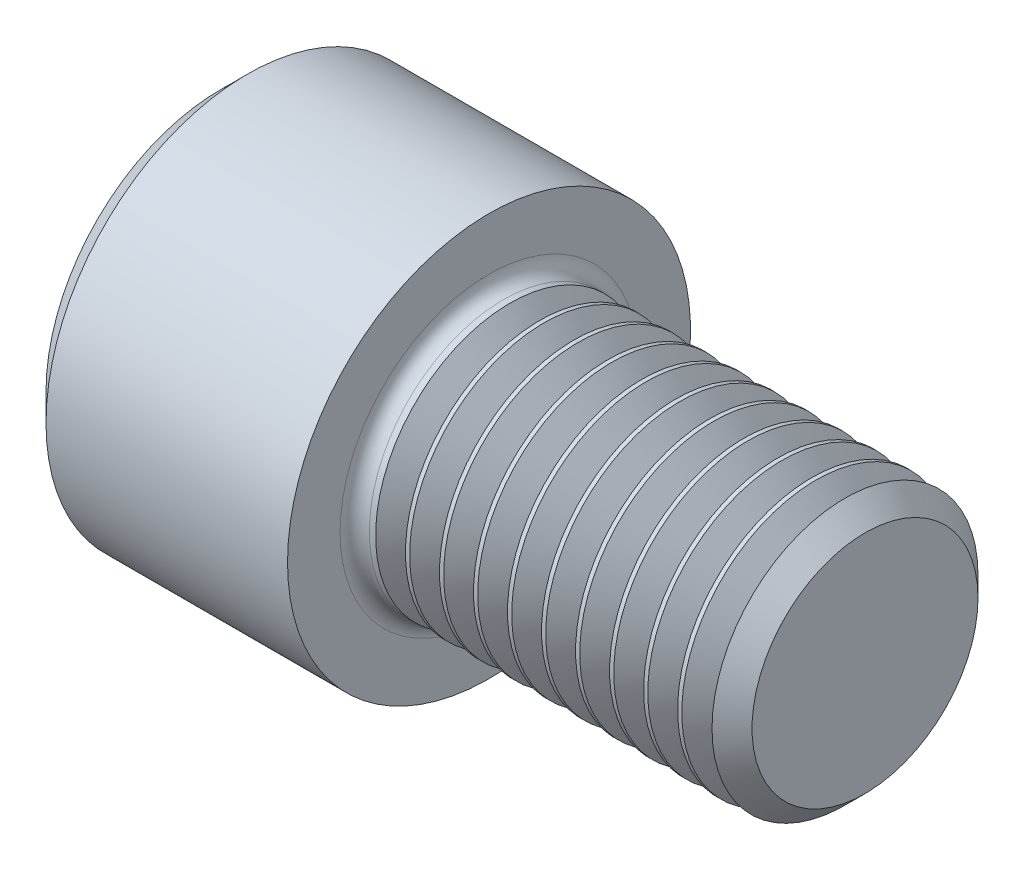
ISO-10303-21;
HEADER;
FILE_DESCRIPTION(('STEP AP214'),'2;1');
FILE_NAME('part.step','',(''),(''),'','','');
FILE_SCHEMA(('AUTOMOTIVE_DESIGN { 1 0 10303 214 1 1 1 1 }'));
ENDSEC;
DATA;
#1=APPLICATION_CONTEXT('core data for automotive mechanical design processes');
#2=APPLICATION_PROTOCOL_DEFINITION('international standard','automotive_design',2000,#1);
#3=PRODUCT_CONTEXT('',#1,'mechanical');
#4=PRODUCT('Part','Part','',(#3));
#5=PRODUCT_RELATED_PRODUCT_CATEGORY('part','',(#4));
#6=PRODUCT_DEFINITION_FORMATION('','',#4);
#7=PRODUCT_DEFINITION_CONTEXT('part definition',#1,'design');
#8=PRODUCT_DEFINITION('design','',#6,#7);
#9=PRODUCT_DEFINITION_SHAPE('','',#8);
#10=(LENGTH_UNIT() NAMED_UNIT(*) SI_UNIT(.MILLI.,.METRE.));
#11=(NAMED_UNIT(*) PLANE_ANGLE_UNIT() SI_UNIT($,.RADIAN.));
#12=(NAMED_UNIT(*) SI_UNIT($,.STERADIAN.) SOLID_ANGLE_UNIT());
#13=UNCERTAINTY_MEASURE_WITH_UNIT(LENGTH_MEASURE(1.E-05),#10,'distance_accuracy_value','');
#14=(GEOMETRIC_REPRESENTATION_CONTEXT(3) GLOBAL_UNCERTAINTY_ASSIGNED_CONTEXT((#13)) GLOBAL_UNIT_ASSIGNED_CONTEXT((#10,
#11,#12)) REPRESENTATION_CONTEXT('',''));
#15=CARTESIAN_POINT('',(0.,0.,0.));
#16=DIRECTION('',(0.,0.,1.));
#17=DIRECTION('',(1.,0.,0.));
#18=AXIS2_PLACEMENT_3D('',#15,#16,#17);
#19=CARTESIAN_POINT('',(3.8354,0.,0.));
#20=DIRECTION('',(-1.,0.,0.));
#21=DIRECTION('',(0.,0.,1.));
#22=AXIS2_PLACEMENT_3D('',#19,#20,#21);
#23=PLANE('',#22);
#24=DIRECTION('',(0.,0.499999999999998,-0.86602540378444));
#25=VECTOR('',#24,1.);
#26=CARTESIAN_POINT('',(3.8354,1.83308710467707,3.175));
#27=LINE('',#26,#25);
#28=CARTESIAN_POINT('',(3.8354,1.83308710467707,3.175));
#29=VERTEX_POINT('',#28);
#30=CARTESIAN_POINT('',(3.83540000001034,2.7496306570156,1.5875));
#31=VERTEX_POINT('',#30);
#32=EDGE_CURVE('E158',#29,#31,#27,.T.);
#33=ORIENTED_EDGE('',*,*,#32,.T.);
#34=CARTESIAN_POINT('',(3.83540000001034,0.,0.));
#35=DIRECTION('',(1.,0.,0.));
#36=DIRECTION('',(0.,1.,0.));
#37=AXIS2_PLACEMENT_3D('',#34,#35,#36);
#38=CIRCLE('',#37,3.17499999999668);
#39=CARTESIAN_POINT('',(3.83540000001034,0.,3.17499999999668));
#40=VERTEX_POINT('',#39);
#41=EDGE_CURVE('E48',#31,#40,#38,.T.);
#42=ORIENTED_EDGE('',*,*,#41,.T.);
#43=DIRECTION('',(0.,1.,0.));
#44=VECTOR('',#43,1.);
#45=CARTESIAN_POINT('',(3.8354,-1.83308710467705,3.175));
#46=LINE('',#45,#44);
#47=EDGE_CURVE('E486',#40,#29,#46,.T.);
#48=ORIENTED_EDGE('',*,*,#47,.T.);
#49=EDGE_LOOP('',(#33,#42,#48));
#50=FACE_BOUND('',#49,.T.);
#51=ADVANCED_FACE('F33',(#50),#23,.T.);
#52=CARTESIAN_POINT('',(3.8354,-1.83308710467705,3.175));
#53=VERTEX_POINT('',#52);
#54=EDGE_CURVE('E487',#53,#40,#46,.T.);
#55=ORIENTED_EDGE('',*,*,#54,.T.);
#56=CARTESIAN_POINT('',(3.83540000001034,-2.74963065701272,1.58749999999834));
#57=VERTEX_POINT('',#56);
#58=EDGE_CURVE('E288',#40,#57,#38,.T.);
#59=ORIENTED_EDGE('',*,*,#58,.T.);
#60=DIRECTION('',(0.,0.500000000000001,0.866025403784438));
#61=VECTOR('',#60,1.);
#62=CARTESIAN_POINT('',(3.8354,-3.66617420935412,0.));
#63=LINE('',#62,#61);
#64=EDGE_CURVE('E483',#57,#53,#63,.T.);
#65=ORIENTED_EDGE('',*,*,#64,.T.);
#66=EDGE_LOOP('',(#55,#59,#65));
#67=FACE_BOUND('',#66,.T.);
#68=ADVANCED_FACE('F121',(#67),#23,.T.);
#69=CARTESIAN_POINT('',(3.8354,-3.66617420935412,0.));
#70=VERTEX_POINT('',#69);
#71=EDGE_CURVE('E484',#70,#57,#63,.T.);
#72=ORIENTED_EDGE('',*,*,#71,.T.);
#73=CARTESIAN_POINT('',(3.83540000001034,-2.74963065701272,-1.58749999999834));
#74=VERTEX_POINT('',#73);
#75=EDGE_CURVE('E498',#57,#74,#38,.T.);
#76=ORIENTED_EDGE('',*,*,#75,.T.);
#77=DIRECTION('',(0.,-0.499999999999999,0.866025403784439));
#78=VECTOR('',#77,1.);
#79=CARTESIAN_POINT('',(3.8354,-1.83308710467706,-3.175));
#80=LINE('',#79,#78);
#81=EDGE_CURVE('E479',#74,#70,#80,.T.);
#82=ORIENTED_EDGE('',*,*,#81,.T.);
#83=EDGE_LOOP('',(#72,#76,#82));
#84=FACE_BOUND('',#83,.T.);
#85=ADVANCED_FACE('F127',(#84),#23,.T.);
#86=CARTESIAN_POINT('',(3.8354,-1.83308710467706,-3.175));
#87=VERTEX_POINT('',#86);
#88=EDGE_CURVE('E470',#87,#74,#80,.T.);
#89=ORIENTED_EDGE('',*,*,#88,.T.);
#90=CARTESIAN_POINT('',(3.83540000001034,0.,-3.17499999999668));
#91=VERTEX_POINT('',#90);
#92=EDGE_CURVE('E499',#74,#91,#38,.T.);
#93=ORIENTED_EDGE('',*,*,#92,.T.);
#94=DIRECTION('',(0.,-1.,0.));
#95=VECTOR('',#94,1.);
#96=CARTESIAN_POINT('',(3.8354,1.83308710467706,-3.175));
#97=LINE('',#96,#95);
#98=EDGE_CURVE('E178',#91,#87,#97,.T.);
#99=ORIENTED_EDGE('',*,*,#98,.T.);
#100=EDGE_LOOP('',(#89,#93,#99));
#101=FACE_BOUND('',#100,.T.);
#102=ADVANCED_FACE('F142',(#101),#23,.T.);
#103=CARTESIAN_POINT('',(3.8354,1.83308710467706,-3.175));
#104=VERTEX_POINT('',#103);
#105=EDGE_CURVE('E473',#104,#91,#97,.T.);
#106=ORIENTED_EDGE('',*,*,#105,.T.);
#107=CARTESIAN_POINT('',(3.83540000001034,2.74963065701272,-1.58749999999835));
#108=VERTEX_POINT('',#107);
#109=EDGE_CURVE('E478',#91,#108,#38,.T.);
#110=ORIENTED_EDGE('',*,*,#109,.T.);
#111=DIRECTION('',(0.,-0.500000000000001,-0.866025403784438));
#112=VECTOR('',#111,1.);
#113=CARTESIAN_POINT('',(3.8354,3.66617420935413,0.));
#114=LINE('',#113,#112);
#115=EDGE_CURVE('E154',#108,#104,#114,.T.);
#116=ORIENTED_EDGE('',*,*,#115,.T.);
#117=EDGE_LOOP('',(#106,#110,#116));
#118=FACE_BOUND('',#117,.T.);
#119=ADVANCED_FACE('F133',(#118),#23,.T.);
#120=CARTESIAN_POINT('',(3.8354,3.66617420935413,0.));
#121=VERTEX_POINT('',#120);
#122=EDGE_CURVE('E146',#121,#108,#114,.T.);
#123=ORIENTED_EDGE('',*,*,#122,.T.);
#124=EDGE_CURVE('E147',#108,#31,#38,.T.);
#125=ORIENTED_EDGE('',*,*,#124,.T.);
#126=EDGE_CURVE('E149',#31,#121,#27,.T.);
#127=ORIENTED_EDGE('',*,*,#126,.T.);
#128=EDGE_LOOP('',(#123,#125,#127));
#129=FACE_BOUND('',#128,.T.);
#130=ADVANCED_FACE('F123',(#129),#23,.T.);
#131=CARTESIAN_POINT('',(7.9375,5.95376,0.));
#132=DIRECTION('',(1.,0.,0.));
#133=DIRECTION('',(0.,0.,-1.));
#134=AXIS2_PLACEMENT_3D('',#131,#132,#133);
#135=PLANE('',#134);
#136=CARTESIAN_POINT('',(7.9375,0.,0.));
#137=DIRECTION('',(1.,0.,0.));
#138=DIRECTION('',(0.,0.,-1.));
#139=AXIS2_PLACEMENT_3D('',#136,#137,#138);
#140=CIRCLE('',#139,4.40054999999997);
#141=CARTESIAN_POINT('',(7.9375,0.,-4.40054999999997));
#142=VERTEX_POINT('',#141);
#143=EDGE_CURVE('E11',#142,#142,#140,.F.);
#144=ORIENTED_EDGE('',*,*,#143,.T.);
#145=EDGE_LOOP('',(#144));
#146=FACE_BOUND('',#145,.T.);
#147=CARTESIAN_POINT('',(7.9375,0.,0.));
#148=DIRECTION('',(-1.,0.,0.));
#149=DIRECTION('',(0.,0.,1.));
#150=AXIS2_PLACEMENT_3D('',#147,#148,#149);
#151=CIRCLE('',#150,5.95376);
#152=CARTESIAN_POINT('',(7.9375,0.,5.95376));
#153=VERTEX_POINT('',#152);
#154=EDGE_CURVE('E281',#153,#153,#151,.T.);
#155=ORIENTED_EDGE('',*,*,#154,.F.);
#156=EDGE_LOOP('',(#155));
#157=FACE_BOUND('',#156,.T.);
#158=ADVANCED_FACE('F132',(#146,#157),#135,.T.);
#159=CARTESIAN_POINT('',(7.9375,0.,0.));
#160=DIRECTION('',(-1.,0.,0.));
#161=DIRECTION('',(0.,0.,1.));
#162=AXIS2_PLACEMENT_3D('',#159,#160,#161);
#163=CYLINDRICAL_SURFACE('',#162,5.95376);
#164=CARTESIAN_POINT('',(0.80009999996206,0.,0.));
#165=DIRECTION('',(-1.,0.,0.));
#166=DIRECTION('',(0.,0.,1.));
#167=AXIS2_PLACEMENT_3D('',#164,#165,#166);
#168=CIRCLE('',#167,5.95376);
#169=CARTESIAN_POINT('',(0.80009999996206,0.,5.95376));
#170=VERTEX_POINT('',#169);
#171=EDGE_CURVE('E287',#170,#170,#168,.F.);
#172=ORIENTED_EDGE('',*,*,#171,.T.);
#173=EDGE_LOOP('',(#172));
#174=FACE_BOUND('',#173,.T.);
#175=ORIENTED_EDGE('',*,*,#154,.T.);
#176=EDGE_LOOP('',(#175));
#177=FACE_BOUND('',#176,.T.);
#178=ADVANCED_FACE('F139',(#174,#177),#163,.T.);
#179=CARTESIAN_POINT('',(0.,0.,0.));
#180=DIRECTION('',(-1.,0.,0.));
#181=DIRECTION('',(0.,0.,1.));
#182=AXIS2_PLACEMENT_3D('',#179,#180,#181);
#183=PLANE('',#182);
#184=CARTESIAN_POINT('',(0.,0.,0.));
#185=DIRECTION('',(-1.,0.,0.));
#186=DIRECTION('',(0.,0.,1.));
#187=AXIS2_PLACEMENT_3D('',#184,#185,#186);
#188=CIRCLE('',#187,5.15366000003795);
#189=CARTESIAN_POINT('',(0.,0.,5.15366000003795));
#190=VERTEX_POINT('',#189);
#191=EDGE_CURVE('E284',#190,#190,#188,.T.);
#192=ORIENTED_EDGE('',*,*,#191,.T.);
#193=EDGE_LOOP('',(#192));
#194=FACE_BOUND('',#193,.T.);
#195=DIRECTION('',(0.,-1.,0.));
#196=VECTOR('',#195,1.);
#197=CARTESIAN_POINT('',(0.,1.83308710467706,-3.175));
#198=LINE('',#197,#196);
#199=CARTESIAN_POINT('',(0.,1.83308710467706,-3.175));
#200=VERTEX_POINT('',#199);
#201=CARTESIAN_POINT('',(0.,-1.83308710467706,-3.175));
#202=VERTEX_POINT('',#201);
#203=EDGE_CURVE('E56',#200,#202,#198,.T.);
#204=ORIENTED_EDGE('',*,*,#203,.F.);
#205=DIRECTION('',(0.,-0.500000000000001,-0.866025403784438));
#206=VECTOR('',#205,1.);
#207=CARTESIAN_POINT('',(0.,3.66617420935413,0.));
#208=LINE('',#207,#206);
#209=CARTESIAN_POINT('',(0.,3.66617420935413,0.));
#210=VERTEX_POINT('',#209);
#211=EDGE_CURVE('E175',#210,#200,#208,.T.);
#212=ORIENTED_EDGE('',*,*,#211,.F.);
#213=DIRECTION('',(0.,0.499999999999998,-0.86602540378444));
#214=VECTOR('',#213,1.);
#215=CARTESIAN_POINT('',(0.,1.83308710467707,3.175));
#216=LINE('',#215,#214);
#217=CARTESIAN_POINT('',(0.,1.83308710467707,3.175));
#218=VERTEX_POINT('',#217);
#219=EDGE_CURVE('E172',#218,#210,#216,.T.);
#220=ORIENTED_EDGE('',*,*,#219,.F.);
#221=DIRECTION('',(0.,1.,0.));
#222=VECTOR('',#221,1.);
#223=CARTESIAN_POINT('',(0.,-1.83308710467705,3.175));
#224=LINE('',#223,#222);
#225=CARTESIAN_POINT('',(0.,-1.83308710467705,3.175));
#226=VERTEX_POINT('',#225);
#227=EDGE_CURVE('E169',#226,#218,#224,.T.);
#228=ORIENTED_EDGE('',*,*,#227,.F.);
#229=DIRECTION('',(0.,0.500000000000001,0.866025403784438));
#230=VECTOR('',#229,1.);
#231=CARTESIAN_POINT('',(0.,-3.66617420935412,0.));
#232=LINE('',#231,#230);
#233=CARTESIAN_POINT('',(0.,-3.66617420935412,0.));
#234=VERTEX_POINT('',#233);
#235=EDGE_CURVE('E166',#234,#226,#232,.T.);
#236=ORIENTED_EDGE('',*,*,#235,.F.);
#237=DIRECTION('',(0.,-0.499999999999999,0.866025403784439));
#238=VECTOR('',#237,1.);
#239=CARTESIAN_POINT('',(0.,-1.83308710467706,-3.175));
#240=LINE('',#239,#238);
#241=EDGE_CURVE('E163',#202,#234,#240,.T.);
#242=ORIENTED_EDGE('',*,*,#241,.F.);
#243=EDGE_LOOP('',(#204,#212,#220,#228,#236,#242));
#244=FACE_BOUND('',#243,.T.);
#245=ADVANCED_FACE('F305',(#194,#244),#183,.T.);
#246=CARTESIAN_POINT('',(8.55560526753094,0.,0.));
#247=DIRECTION('',(-1.,0.,0.));
#248=DIRECTION('',(0.,0.,1.));
#249=AXIS2_PLACEMENT_3D('',#246,#247,#248);
#250=CYLINDRICAL_SURFACE('',#249,3.96874999999997);
#251=CARTESIAN_POINT('',(8.3693,0.,0.));
#252=DIRECTION('',(1.,0.,0.));
#253=DIRECTION('',(0.,0.,-1.));
#254=AXIS2_PLACEMENT_3D('',#251,#252,#253);
#255=CIRCLE('',#254,3.96874999999997);
#256=CARTESIAN_POINT('',(8.3693,0.,-3.96874999999997));
#257=VERTEX_POINT('',#256);
#258=EDGE_CURVE('E41',#257,#257,#255,.T.);
#259=ORIENTED_EDGE('',*,*,#258,.T.);
#260=EDGE_LOOP('',(#259));
#261=FACE_BOUND('',#260,.T.);
#262=CARTESIAN_POINT('',(8.55560526753094,0.,0.));
#263=DIRECTION('',(1.,0.,0.));
#264=DIRECTION('',(0.,0.,-1.));
#265=AXIS2_PLACEMENT_3D('',#262,#263,#264);
#266=CIRCLE('',#265,3.96874999999997);
#267=CARTESIAN_POINT('',(8.55560526753094,0.,-3.96874999999997));
#268=VERTEX_POINT('',#267);
#269=EDGE_CURVE('E278',#268,#268,#266,.T.);
#270=ORIENTED_EDGE('',*,*,#269,.F.);
#271=EDGE_LOOP('',(#270));
#272=FACE_BOUND('',#271,.T.);
#273=ADVANCED_FACE('F293',(#261,#272),#250,.T.);
#274=CARTESIAN_POINT('',(8.55560526753094,0.,0.));
#275=DIRECTION('',(-1.,0.,0.));
#276=DIRECTION('',(0.,0.,-1.));
#277=AXIS2_PLACEMENT_3D('',#274,#275,#276);
#278=CONICAL_SURFACE('',#277,3.96874999998106,0.959931088537398);
#279=CARTESIAN_POINT('',(8.99668000005249,0.,0.));
#280=DIRECTION('',(1.,0.,0.));
#281=DIRECTION('',(0.,0.,-1.));
#282=AXIS2_PLACEMENT_3D('',#279,#280,#281);
#283=CIRCLE('',#282,3.33882999998584);
#284=CARTESIAN_POINT('',(8.99668000005249,0.,-3.33882999998584));
#285=VERTEX_POINT('',#284);
#286=EDGE_CURVE('E275',#285,#285,#283,.T.);
#287=ORIENTED_EDGE('',*,*,#286,.F.);
#288=EDGE_LOOP('',(#287));
#289=FACE_BOUND('',#288,.T.);
#290=ORIENTED_EDGE('',*,*,#269,.T.);
#291=EDGE_LOOP('',(#290));
#292=FACE_BOUND('',#291,.T.);
#293=ADVANCED_FACE('F316',(#289,#292),#278,.T.);
#294=CARTESIAN_POINT('',(8.99668000005249,0.,0.));
#295=DIRECTION('',(1.,0.,0.));
#296=DIRECTION('',(0.,0.,-1.));
#297=AXIS2_PLACEMENT_3D('',#294,#295,#296);
#298=CONICAL_SURFACE('',#297,3.33883000009951,0.959931088597959);
#299=CARTESIAN_POINT('',(9.43775473245978,0.,0.));
#300=DIRECTION('',(1.,0.,0.));
#301=DIRECTION('',(0.,0.,-1.));
#302=AXIS2_PLACEMENT_3D('',#299,#300,#301);
#303=CIRCLE('',#302,3.96875000001274);
#304=CARTESIAN_POINT('',(9.43775473245978,0.,-3.96875000001274));
#305=VERTEX_POINT('',#304);
#306=EDGE_CURVE('E272',#305,#305,#303,.T.);
#307=ORIENTED_EDGE('',*,*,#306,.F.);
#308=EDGE_LOOP('',(#307));
#309=FACE_BOUND('',#308,.T.);
#310=ORIENTED_EDGE('',*,*,#286,.T.);
#311=EDGE_LOOP('',(#310));
#312=FACE_BOUND('',#311,.T.);
#313=ADVANCED_FACE('F319',(#309,#312),#298,.T.);
#314=CARTESIAN_POINT('',(9.56093726753093,0.,0.));
#315=DIRECTION('',(-1.,0.,0.));
#316=DIRECTION('',(0.,0.,1.));
#317=AXIS2_PLACEMENT_3D('',#314,#315,#316);
#318=CYLINDRICAL_SURFACE('',#317,3.96874999999997);
#319=CARTESIAN_POINT('',(9.56093726753093,0.,0.));
#320=DIRECTION('',(1.,0.,0.));
#321=DIRECTION('',(0.,0.,-1.));
#322=AXIS2_PLACEMENT_3D('',#319,#320,#321);
#323=CIRCLE('',#322,3.96874999999997);
#324=CARTESIAN_POINT('',(9.56093726753093,0.,-3.96874999999997));
#325=VERTEX_POINT('',#324);
#326=EDGE_CURVE('E269',#325,#325,#323,.T.);
#327=ORIENTED_EDGE('',*,*,#326,.F.);
#328=EDGE_LOOP('',(#327));
#329=FACE_BOUND('',#328,.T.);
#330=ORIENTED_EDGE('',*,*,#306,.T.);
#331=EDGE_LOOP('',(#330));
#332=FACE_BOUND('',#331,.T.);
#333=ADVANCED_FACE('F323',(#329,#332),#318,.T.);
#334=CARTESIAN_POINT('',(9.56093726753093,0.,0.));
#335=DIRECTION('',(-1.,0.,0.));
#336=DIRECTION('',(0.,0.,-1.));
#337=AXIS2_PLACEMENT_3D('',#334,#335,#336);
#338=CONICAL_SURFACE('',#337,3.9687499999482,0.95993108864035);
#339=CARTESIAN_POINT('',(10.0020119999726,0.,0.));
#340=DIRECTION('',(1.,0.,0.));
#341=DIRECTION('',(0.,0.,-1.));
#342=AXIS2_PLACEMENT_3D('',#339,#340,#341);
#343=CIRCLE('',#342,3.33882999992899);
#344=CARTESIAN_POINT('',(10.0020119999726,0.,-3.33882999992899));
#345=VERTEX_POINT('',#344);
#346=EDGE_CURVE('E266',#345,#345,#343,.T.);
#347=ORIENTED_EDGE('',*,*,#346,.F.);
#348=EDGE_LOOP('',(#347));
#349=FACE_BOUND('',#348,.T.);
#350=ORIENTED_EDGE('',*,*,#326,.T.);
#351=EDGE_LOOP('',(#350));
#352=FACE_BOUND('',#351,.T.);
#353=ADVANCED_FACE('F327',(#349,#352),#338,.T.);
#354=CARTESIAN_POINT('',(10.0020119999726,0.,0.));
#355=DIRECTION('',(1.,0.,0.));
#356=DIRECTION('',(0.,0.,-1.));
#357=AXIS2_PLACEMENT_3D('',#354,#355,#356);
#358=CONICAL_SURFACE('',#357,3.33882999993715,0.959931088597959);
#359=CARTESIAN_POINT('',(10.4430867324936,0.,0.));
#360=DIRECTION('',(1.,0.,0.));
#361=DIRECTION('',(0.,0.,-1.));
#362=AXIS2_PLACEMENT_3D('',#359,#360,#361);
#363=CIRCLE('',#362,3.96875000001273);
#364=CARTESIAN_POINT('',(10.4430867324936,0.,-3.96875000001274));
#365=VERTEX_POINT('',#364);
#366=EDGE_CURVE('E263',#365,#365,#363,.T.);
#367=ORIENTED_EDGE('',*,*,#366,.F.);
#368=EDGE_LOOP('',(#367));
#369=FACE_BOUND('',#368,.T.);
#370=ORIENTED_EDGE('',*,*,#346,.T.);
#371=EDGE_LOOP('',(#370));
#372=FACE_BOUND('',#371,.T.);
#373=ADVANCED_FACE('F331',(#369,#372),#358,.T.);
#374=CARTESIAN_POINT('',(10.5662692675309,0.,0.));
#375=DIRECTION('',(-1.,0.,0.));
#376=DIRECTION('',(0.,0.,1.));
#377=AXIS2_PLACEMENT_3D('',#374,#375,#376);
#378=CYLINDRICAL_SURFACE('',#377,3.96874999999997);
#379=CARTESIAN_POINT('',(10.5662692675309,0.,0.));
#380=DIRECTION('',(1.,0.,0.));
#381=DIRECTION('',(0.,0.,-1.));
#382=AXIS2_PLACEMENT_3D('',#379,#380,#381);
#383=CIRCLE('',#382,3.96874999999997);
#384=CARTESIAN_POINT('',(10.5662692675309,0.,-3.96874999999997));
#385=VERTEX_POINT('',#384);
#386=EDGE_CURVE('E260',#385,#385,#383,.T.);
#387=ORIENTED_EDGE('',*,*,#386,.F.);
#388=EDGE_LOOP('',(#387));
#389=FACE_BOUND('',#388,.T.);
#390=ORIENTED_EDGE('',*,*,#366,.T.);
#391=EDGE_LOOP('',(#390));
#392=FACE_BOUND('',#391,.T.);
#393=ADVANCED_FACE('F335',(#389,#392),#378,.T.);
#394=CARTESIAN_POINT('',(10.5662692675309,0.,0.));
#395=DIRECTION('',(-1.,0.,0.));
#396=DIRECTION('',(0.,0.,-1.));
#397=AXIS2_PLACEMENT_3D('',#394,#395,#396);
#398=CONICAL_SURFACE('',#397,3.96874999999652,0.959931088537398);
#399=CARTESIAN_POINT('',(11.0073440000633,0.,0.));
#400=DIRECTION('',(1.,0.,0.));
#401=DIRECTION('',(0.,0.,-1.));
#402=AXIS2_PLACEMENT_3D('',#399,#400,#401);
#403=CIRCLE('',#402,3.33882999998583);
#404=CARTESIAN_POINT('',(11.0073440000633,0.,-3.33882999998584));
#405=VERTEX_POINT('',#404);
#406=EDGE_CURVE('E257',#405,#405,#403,.T.);
#407=ORIENTED_EDGE('',*,*,#406,.F.);
#408=EDGE_LOOP('',(#407));
#409=FACE_BOUND('',#408,.T.);
#410=ORIENTED_EDGE('',*,*,#386,.T.);
#411=EDGE_LOOP('',(#410));
#412=FACE_BOUND('',#411,.T.);
#413=ADVANCED_FACE('F339',(#409,#412),#398,.T.);
#414=CARTESIAN_POINT('',(11.0073440000633,0.,0.));
#415=DIRECTION('',(1.,0.,0.));
#416=DIRECTION('',(0.,0.,-1.));
#417=AXIS2_PLACEMENT_3D('',#414,#415,#416);
#418=CONICAL_SURFACE('',#417,3.33883000009951,0.959931088597958);
#419=CARTESIAN_POINT('',(11.4484187324706,0.,0.));
#420=DIRECTION('',(1.,0.,0.));
#421=DIRECTION('',(0.,0.,-1.));
#422=AXIS2_PLACEMENT_3D('',#419,#420,#421);
#423=CIRCLE('',#422,3.96875000001273);
#424=CARTESIAN_POINT('',(11.4484187324706,0.,-3.96875000001273));
#425=VERTEX_POINT('',#424);
#426=EDGE_CURVE('E254',#425,#425,#423,.T.);
#427=ORIENTED_EDGE('',*,*,#426,.F.);
#428=EDGE_LOOP('',(#427));
#429=FACE_BOUND('',#428,.T.);
#430=ORIENTED_EDGE('',*,*,#406,.T.);
#431=EDGE_LOOP('',(#430));
#432=FACE_BOUND('',#431,.T.);
#433=ADVANCED_FACE('F343',(#429,#432),#418,.T.);
#434=CARTESIAN_POINT('',(11.5716012675309,0.,0.));
#435=DIRECTION('',(-1.,0.,0.));
#436=DIRECTION('',(0.,0.,1.));
#437=AXIS2_PLACEMENT_3D('',#434,#435,#436);
#438=CYLINDRICAL_SURFACE('',#437,3.96874999999997);
#439=CARTESIAN_POINT('',(11.5716012675309,0.,0.));
#440=DIRECTION('',(1.,0.,0.));
#441=DIRECTION('',(0.,0.,-1.));
#442=AXIS2_PLACEMENT_3D('',#439,#440,#441);
#443=CIRCLE('',#442,3.96874999999997);
#444=CARTESIAN_POINT('',(11.5716012675309,0.,-3.96874999999997));
#445=VERTEX_POINT('',#444);
#446=EDGE_CURVE('E251',#445,#445,#443,.T.);
#447=ORIENTED_EDGE('',*,*,#446,.F.);
#448=EDGE_LOOP('',(#447));
#449=FACE_BOUND('',#448,.T.);
#450=ORIENTED_EDGE('',*,*,#426,.T.);
#451=EDGE_LOOP('',(#450));
#452=FACE_BOUND('',#451,.T.);
#453=ADVANCED_FACE('F347',(#449,#452),#438,.T.);
#454=CARTESIAN_POINT('',(11.5716012675309,0.,0.));
#455=DIRECTION('',(-1.,0.,0.));
#456=DIRECTION('',(0.,0.,-1.));
#457=AXIS2_PLACEMENT_3D('',#454,#455,#456);
#458=CONICAL_SURFACE('',#457,3.96874999996365,0.959931088537398);
#459=CARTESIAN_POINT('',(12.0126760000403,0.,0.));
#460=DIRECTION('',(1.,0.,0.));
#461=DIRECTION('',(0.,0.,-1.));
#462=AXIS2_PLACEMENT_3D('',#459,#460,#461);
#463=CIRCLE('',#462,3.33882999998584);
#464=CARTESIAN_POINT('',(12.0126760000403,0.,-3.33882999998584));
#465=VERTEX_POINT('',#464);
#466=EDGE_CURVE('E248',#465,#465,#463,.T.);
#467=ORIENTED_EDGE('',*,*,#466,.F.);
#468=EDGE_LOOP('',(#467));
#469=FACE_BOUND('',#468,.T.);
#470=ORIENTED_EDGE('',*,*,#446,.T.);
#471=EDGE_LOOP('',(#470));
#472=FACE_BOUND('',#471,.T.);
#473=ADVANCED_FACE('F351',(#469,#472),#458,.T.);
#474=CARTESIAN_POINT('',(12.0126760000403,0.,0.));
#475=DIRECTION('',(1.,0.,0.));
#476=DIRECTION('',(0.,0.,-1.));
#477=AXIS2_PLACEMENT_3D('',#474,#475,#476);
#478=CONICAL_SURFACE('',#477,3.33883000009951,0.959931088597959);
#479=CARTESIAN_POINT('',(12.4537507324476,0.,0.));
#480=DIRECTION('',(1.,0.,0.));
#481=DIRECTION('',(0.,0.,-1.));
#482=AXIS2_PLACEMENT_3D('',#479,#480,#481);
#483=CIRCLE('',#482,3.96875000001274);
#484=CARTESIAN_POINT('',(12.4537507324476,0.,-3.96875000001274));
#485=VERTEX_POINT('',#484);
#486=EDGE_CURVE('E245',#485,#485,#483,.T.);
#487=ORIENTED_EDGE('',*,*,#486,.F.);
#488=EDGE_LOOP('',(#487));
#489=FACE_BOUND('',#488,.T.);
#490=ORIENTED_EDGE('',*,*,#466,.T.);
#491=EDGE_LOOP('',(#490));
#492=FACE_BOUND('',#491,.T.);
#493=ADVANCED_FACE('F355',(#489,#492),#478,.T.);
#494=CARTESIAN_POINT('',(12.5769332675309,0.,0.));
#495=DIRECTION('',(-1.,0.,0.));
#496=DIRECTION('',(0.,0.,1.));
#497=AXIS2_PLACEMENT_3D('',#494,#495,#496);
#498=CYLINDRICAL_SURFACE('',#497,3.96874999999997);
#499=CARTESIAN_POINT('',(12.5769332675309,0.,0.));
#500=DIRECTION('',(1.,0.,0.));
#501=DIRECTION('',(0.,0.,-1.));
#502=AXIS2_PLACEMENT_3D('',#499,#500,#501);
#503=CIRCLE('',#502,3.96874999999997);
#504=CARTESIAN_POINT('',(12.5769332675309,0.,-3.96874999999997));
#505=VERTEX_POINT('',#504);
#506=EDGE_CURVE('E242',#505,#505,#503,.T.);
#507=ORIENTED_EDGE('',*,*,#506,.F.);
#508=EDGE_LOOP('',(#507));
#509=FACE_BOUND('',#508,.T.);
#510=ORIENTED_EDGE('',*,*,#486,.T.);
#511=EDGE_LOOP('',(#510));
#512=FACE_BOUND('',#511,.T.);
#513=ADVANCED_FACE('F359',(#509,#512),#498,.T.);
#514=CARTESIAN_POINT('',(12.5769332675309,0.,0.));
#515=DIRECTION('',(-1.,0.,0.));
#516=DIRECTION('',(0.,0.,-1.));
#517=AXIS2_PLACEMENT_3D('',#514,#515,#516);
#518=CONICAL_SURFACE('',#517,3.96875000001197,0.95993108864035);
#519=CARTESIAN_POINT('',(13.0180080000173,0.,0.));
#520=DIRECTION('',(1.,0.,0.));
#521=DIRECTION('',(0.,0.,-1.));
#522=AXIS2_PLACEMENT_3D('',#519,#520,#521);
#523=CIRCLE('',#522,3.33882999992899);
#524=CARTESIAN_POINT('',(13.0180080000173,0.,-3.33882999992899));
#525=VERTEX_POINT('',#524);
#526=EDGE_CURVE('E239',#525,#525,#523,.T.);
#527=ORIENTED_EDGE('',*,*,#526,.F.);
#528=EDGE_LOOP('',(#527));
#529=FACE_BOUND('',#528,.T.);
#530=ORIENTED_EDGE('',*,*,#506,.T.);
#531=EDGE_LOOP('',(#530));
#532=FACE_BOUND('',#531,.T.);
#533=ADVANCED_FACE('F363',(#529,#532),#518,.T.);
#534=CARTESIAN_POINT('',(13.0180080000173,0.,0.));
#535=DIRECTION('',(1.,0.,0.));
#536=DIRECTION('',(0.,0.,-1.));
#537=AXIS2_PLACEMENT_3D('',#534,#535,#536);
#538=CONICAL_SURFACE('',#537,3.33883000001833,0.959931088597959);
#539=CARTESIAN_POINT('',(13.4590827324814,0.,0.));
#540=DIRECTION('',(1.,0.,0.));
#541=DIRECTION('',(0.,0.,-1.));
#542=AXIS2_PLACEMENT_3D('',#539,#540,#541);
#543=CIRCLE('',#542,3.96875000001274);
#544=CARTESIAN_POINT('',(13.4590827324814,0.,-3.96875000001274));
#545=VERTEX_POINT('',#544);
#546=EDGE_CURVE('E236',#545,#545,#543,.T.);
#547=ORIENTED_EDGE('',*,*,#546,.F.);
#548=EDGE_LOOP('',(#547));
#549=FACE_BOUND('',#548,.T.);
#550=ORIENTED_EDGE('',*,*,#526,.T.);
#551=EDGE_LOOP('',(#550));
#552=FACE_BOUND('',#551,.T.);
#553=ADVANCED_FACE('F367',(#549,#552),#538,.T.);
#554=CARTESIAN_POINT('',(13.5822652675309,0.,0.));
#555=DIRECTION('',(-1.,0.,0.));
#556=DIRECTION('',(0.,0.,1.));
#557=AXIS2_PLACEMENT_3D('',#554,#555,#556);
#558=CYLINDRICAL_SURFACE('',#557,3.96874999999997);
#559=CARTESIAN_POINT('',(13.5822652675309,0.,0.));
#560=DIRECTION('',(1.,0.,0.));
#561=DIRECTION('',(0.,0.,-1.));
#562=AXIS2_PLACEMENT_3D('',#559,#560,#561);
#563=CIRCLE('',#562,3.96874999999997);
#564=CARTESIAN_POINT('',(13.5822652675309,0.,-3.96874999999997));
#565=VERTEX_POINT('',#564);
#566=EDGE_CURVE('E233',#565,#565,#563,.T.);
#567=ORIENTED_EDGE('',*,*,#566,.F.);
#568=EDGE_LOOP('',(#567));
#569=FACE_BOUND('',#568,.T.);
#570=ORIENTED_EDGE('',*,*,#546,.T.);
#571=EDGE_LOOP('',(#570));
#572=FACE_BOUND('',#571,.T.);
#573=ADVANCED_FACE('F371',(#569,#572),#558,.T.);
#574=CARTESIAN_POINT('',(13.5822652675309,0.,0.));
#575=DIRECTION('',(-1.,0.,0.));
#576=DIRECTION('',(0.,0.,-1.));
#577=AXIS2_PLACEMENT_3D('',#574,#575,#576);
#578=CONICAL_SURFACE('',#577,3.96874999997911,0.95993108864035);
#579=CARTESIAN_POINT('',(14.0233399999943,0.,0.));
#580=DIRECTION('',(1.,0.,0.));
#581=DIRECTION('',(0.,0.,-1.));
#582=AXIS2_PLACEMENT_3D('',#579,#580,#581);
#583=CIRCLE('',#582,3.33882999992899);
#584=CARTESIAN_POINT('',(14.0233399999943,0.,-3.33882999992899));
#585=VERTEX_POINT('',#584);
#586=EDGE_CURVE('E230',#585,#585,#583,.T.);
#587=ORIENTED_EDGE('',*,*,#586,.F.);
#588=EDGE_LOOP('',(#587));
#589=FACE_BOUND('',#588,.T.);
#590=ORIENTED_EDGE('',*,*,#566,.T.);
#591=EDGE_LOOP('',(#590));
#592=FACE_BOUND('',#591,.T.);
#593=ADVANCED_FACE('F375',(#589,#592),#578,.T.);
#594=CARTESIAN_POINT('',(14.0233399999943,0.,0.));
#595=DIRECTION('',(1.,0.,0.));
#596=DIRECTION('',(0.,0.,-1.));
#597=AXIS2_PLACEMENT_3D('',#594,#595,#596);
#598=CONICAL_SURFACE('',#597,3.33883000001833,0.959931088597958);
#599=CARTESIAN_POINT('',(14.4644147324584,0.,0.));
#600=DIRECTION('',(1.,0.,0.));
#601=DIRECTION('',(0.,0.,-1.));
#602=AXIS2_PLACEMENT_3D('',#599,#600,#601);
#603=CIRCLE('',#602,3.96875000001274);
#604=CARTESIAN_POINT('',(14.4644147324584,0.,-3.96875000001274));
#605=VERTEX_POINT('',#604);
#606=EDGE_CURVE('E227',#605,#605,#603,.T.);
#607=ORIENTED_EDGE('',*,*,#606,.F.);
#608=EDGE_LOOP('',(#607));
#609=FACE_BOUND('',#608,.T.);
#610=ORIENTED_EDGE('',*,*,#586,.T.);
#611=EDGE_LOOP('',(#610));
#612=FACE_BOUND('',#611,.T.);
#613=ADVANCED_FACE('F379',(#609,#612),#598,.T.);
#614=CARTESIAN_POINT('',(14.5875972675309,0.,0.));
#615=DIRECTION('',(-1.,0.,0.));
#616=DIRECTION('',(0.,0.,1.));
#617=AXIS2_PLACEMENT_3D('',#614,#615,#616);
#618=CYLINDRICAL_SURFACE('',#617,3.96874999999997);
#619=CARTESIAN_POINT('',(14.5875972675309,0.,0.));
#620=DIRECTION('',(1.,0.,0.));
#621=DIRECTION('',(0.,0.,-1.));
#622=AXIS2_PLACEMENT_3D('',#619,#620,#621);
#623=CIRCLE('',#622,3.96874999999997);
#624=CARTESIAN_POINT('',(14.5875972675309,0.,-3.96874999999997));
#625=VERTEX_POINT('',#624);
#626=EDGE_CURVE('E224',#625,#625,#623,.T.);
#627=ORIENTED_EDGE('',*,*,#626,.F.);
#628=EDGE_LOOP('',(#627));
#629=FACE_BOUND('',#628,.T.);
#630=ORIENTED_EDGE('',*,*,#606,.T.);
#631=EDGE_LOOP('',(#630));
#632=FACE_BOUND('',#631,.T.);
#633=ADVANCED_FACE('F383',(#629,#632),#618,.T.);
#634=CARTESIAN_POINT('',(14.5875972675309,0.,0.));
#635=DIRECTION('',(-1.,0.,0.));
#636=DIRECTION('',(0.,0.,-1.));
#637=AXIS2_PLACEMENT_3D('',#634,#635,#636);
#638=CONICAL_SURFACE('',#637,3.96875000002742,0.95993108864035);
#639=CARTESIAN_POINT('',(15.0286719999713,0.,0.));
#640=DIRECTION('',(1.,0.,0.));
#641=DIRECTION('',(0.,0.,-1.));
#642=AXIS2_PLACEMENT_3D('',#639,#640,#641);
#643=CIRCLE('',#642,3.33883000001017);
#644=CARTESIAN_POINT('',(15.0286719999713,0.,-3.33883000001017));
#645=VERTEX_POINT('',#644);
#646=EDGE_CURVE('E221',#645,#645,#643,.T.);
#647=ORIENTED_EDGE('',*,*,#646,.F.);
#648=EDGE_LOOP('',(#647));
#649=FACE_BOUND('',#648,.T.);
#650=ORIENTED_EDGE('',*,*,#626,.T.);
#651=EDGE_LOOP('',(#650));
#652=FACE_BOUND('',#651,.T.);
#653=ADVANCED_FACE('F387',(#649,#652),#638,.T.);
#654=CARTESIAN_POINT('',(15.0286719999713,0.,0.));
#655=DIRECTION('',(1.,0.,0.));
#656=DIRECTION('',(0.,0.,-1.));
#657=AXIS2_PLACEMENT_3D('',#654,#655,#656);
#658=CONICAL_SURFACE('',#657,3.33882999993715,0.959931088597957);
#659=CARTESIAN_POINT('',(15.4697467324922,0.,0.));
#660=DIRECTION('',(1.,0.,0.));
#661=DIRECTION('',(0.,0.,-1.));
#662=AXIS2_PLACEMENT_3D('',#659,#660,#661);
#663=CIRCLE('',#662,3.96875000001273);
#664=CARTESIAN_POINT('',(15.4697467324922,0.,-3.96875000001274));
#665=VERTEX_POINT('',#664);
#666=EDGE_CURVE('E218',#665,#665,#663,.T.);
#667=ORIENTED_EDGE('',*,*,#666,.F.);
#668=EDGE_LOOP('',(#667));
#669=FACE_BOUND('',#668,.T.);
#670=ORIENTED_EDGE('',*,*,#646,.T.);
#671=EDGE_LOOP('',(#670));
#672=FACE_BOUND('',#671,.T.);
#673=ADVANCED_FACE('F391',(#669,#672),#658,.T.);
#674=CARTESIAN_POINT('',(15.5929292675309,0.,0.));
#675=DIRECTION('',(-1.,0.,0.));
#676=DIRECTION('',(0.,0.,1.));
#677=AXIS2_PLACEMENT_3D('',#674,#675,#676);
#678=CYLINDRICAL_SURFACE('',#677,3.96874999999997);
#679=CARTESIAN_POINT('',(15.5929292675309,0.,0.));
#680=DIRECTION('',(1.,0.,0.));
#681=DIRECTION('',(0.,0.,-1.));
#682=AXIS2_PLACEMENT_3D('',#679,#680,#681);
#683=CIRCLE('',#682,3.96874999999997);
#684=CARTESIAN_POINT('',(15.5929292675309,0.,-3.96874999999997));
#685=VERTEX_POINT('',#684);
#686=EDGE_CURVE('E215',#685,#685,#683,.T.);
#687=ORIENTED_EDGE('',*,*,#686,.F.);
#688=EDGE_LOOP('',(#687));
#689=FACE_BOUND('',#688,.T.);
#690=ORIENTED_EDGE('',*,*,#666,.T.);
#691=EDGE_LOOP('',(#690));
#692=FACE_BOUND('',#691,.T.);
#693=ADVANCED_FACE('F395',(#689,#692),#678,.T.);
#694=CARTESIAN_POINT('',(15.5929292675309,0.,0.));
#695=DIRECTION('',(-1.,0.,0.));
#696=DIRECTION('',(0.,0.,-1.));
#697=AXIS2_PLACEMENT_3D('',#694,#695,#696);
#698=CONICAL_SURFACE('',#697,3.96874999999456,0.959931088537401);
#699=CARTESIAN_POINT('',(16.0340040000619,0.,0.));
#700=DIRECTION('',(1.,0.,0.));
#701=DIRECTION('',(0.,0.,-1.));
#702=AXIS2_PLACEMENT_3D('',#699,#700,#701);
#703=CIRCLE('',#702,3.33882999998583);
#704=CARTESIAN_POINT('',(16.0340040000619,0.,-3.33882999998583));
#705=VERTEX_POINT('',#704);
#706=EDGE_CURVE('E212',#705,#705,#703,.T.);
#707=ORIENTED_EDGE('',*,*,#706,.F.);
#708=EDGE_LOOP('',(#707));
#709=FACE_BOUND('',#708,.T.);
#710=ORIENTED_EDGE('',*,*,#686,.T.);
#711=EDGE_LOOP('',(#710));
#712=FACE_BOUND('',#711,.T.);
#713=ADVANCED_FACE('F399',(#709,#712),#698,.T.);
#714=CARTESIAN_POINT('',(16.0340040000619,0.,0.));
#715=DIRECTION('',(1.,0.,0.));
#716=DIRECTION('',(0.,0.,-1.));
#717=AXIS2_PLACEMENT_3D('',#714,#715,#716);
#718=CONICAL_SURFACE('',#717,3.33883000009951,0.959931088597959);
#719=CARTESIAN_POINT('',(16.4750787324692,0.,0.));
#720=DIRECTION('',(1.,0.,0.));
#721=DIRECTION('',(0.,0.,-1.));
#722=AXIS2_PLACEMENT_3D('',#719,#720,#721);
#723=CIRCLE('',#722,3.96875000001274);
#724=CARTESIAN_POINT('',(16.4750787324692,0.,-3.96875000001274));
#725=VERTEX_POINT('',#724);
#726=EDGE_CURVE('E209',#725,#725,#723,.T.);
#727=ORIENTED_EDGE('',*,*,#726,.F.);
#728=EDGE_LOOP('',(#727));
#729=FACE_BOUND('',#728,.T.);
#730=ORIENTED_EDGE('',*,*,#706,.T.);
#731=EDGE_LOOP('',(#730));
#732=FACE_BOUND('',#731,.T.);
#733=ADVANCED_FACE('F403',(#729,#732),#718,.T.);
#734=CARTESIAN_POINT('',(16.5982612675309,0.,0.));
#735=DIRECTION('',(-1.,0.,0.));
#736=DIRECTION('',(0.,0.,1.));
#737=AXIS2_PLACEMENT_3D('',#734,#735,#736);
#738=CYLINDRICAL_SURFACE('',#737,3.96874999999997);
#739=CARTESIAN_POINT('',(16.5982612675309,0.,0.));
#740=DIRECTION('',(1.,0.,0.));
#741=DIRECTION('',(0.,0.,-1.));
#742=AXIS2_PLACEMENT_3D('',#739,#740,#741);
#743=CIRCLE('',#742,3.96874999999997);
#744=CARTESIAN_POINT('',(16.5982612675309,0.,-3.96874999999997));
#745=VERTEX_POINT('',#744);
#746=EDGE_CURVE('E206',#745,#745,#743,.T.);
#747=ORIENTED_EDGE('',*,*,#746,.F.);
#748=EDGE_LOOP('',(#747));
#749=FACE_BOUND('',#748,.T.);
#750=ORIENTED_EDGE('',*,*,#726,.T.);
#751=EDGE_LOOP('',(#750));
#752=FACE_BOUND('',#751,.T.);
#753=ADVANCED_FACE('F407',(#749,#752),#738,.T.);
#754=CARTESIAN_POINT('',(16.5982612675309,0.,0.));
#755=DIRECTION('',(-1.,0.,0.));
#756=DIRECTION('',(0.,0.,-1.));
#757=AXIS2_PLACEMENT_3D('',#754,#755,#756);
#758=CONICAL_SURFACE('',#757,3.9687499999617,0.9599310885374);
#759=CARTESIAN_POINT('',(17.0393360000389,0.,0.));
#760=DIRECTION('',(1.,0.,0.));
#761=DIRECTION('',(0.,0.,-1.));
#762=AXIS2_PLACEMENT_3D('',#759,#760,#761);
#763=CIRCLE('',#762,3.33882999998583);
#764=CARTESIAN_POINT('',(17.0393360000389,0.,-3.33882999998583));
#765=VERTEX_POINT('',#764);
#766=EDGE_CURVE('E203',#765,#765,#763,.T.);
#767=ORIENTED_EDGE('',*,*,#766,.F.);
#768=EDGE_LOOP('',(#767));
#769=FACE_BOUND('',#768,.T.);
#770=ORIENTED_EDGE('',*,*,#746,.T.);
#771=EDGE_LOOP('',(#770));
#772=FACE_BOUND('',#771,.T.);
#773=ADVANCED_FACE('F411',(#769,#772),#758,.T.);
#774=CARTESIAN_POINT('',(17.0393360000389,0.,0.));
#775=DIRECTION('',(1.,0.,0.));
#776=DIRECTION('',(0.,0.,-1.));
#777=AXIS2_PLACEMENT_3D('',#774,#775,#776);
#778=CONICAL_SURFACE('',#777,3.33883000009951,0.959931088597959);
#779=CARTESIAN_POINT('',(17.4804107324462,0.,0.));
#780=DIRECTION('',(1.,0.,0.));
#781=DIRECTION('',(0.,0.,-1.));
#782=AXIS2_PLACEMENT_3D('',#779,#780,#781);
#783=CIRCLE('',#782,3.96875000001274);
#784=CARTESIAN_POINT('',(17.4804107324462,0.,-3.96875000001274));
#785=VERTEX_POINT('',#784);
#786=EDGE_CURVE('E200',#785,#785,#783,.T.);
#787=ORIENTED_EDGE('',*,*,#786,.F.);
#788=EDGE_LOOP('',(#787));
#789=FACE_BOUND('',#788,.T.);
#790=ORIENTED_EDGE('',*,*,#766,.T.);
#791=EDGE_LOOP('',(#790));
#792=FACE_BOUND('',#791,.T.);
#793=ADVANCED_FACE('F415',(#789,#792),#778,.T.);
#794=CARTESIAN_POINT('',(17.6035932675309,0.,0.));
#795=DIRECTION('',(-1.,0.,0.));
#796=DIRECTION('',(0.,0.,1.));
#797=AXIS2_PLACEMENT_3D('',#794,#795,#796);
#798=CYLINDRICAL_SURFACE('',#797,3.96874999999997);
#799=CARTESIAN_POINT('',(17.6035932675309,0.,0.));
#800=DIRECTION('',(1.,0.,0.));
#801=DIRECTION('',(0.,0.,-1.));
#802=AXIS2_PLACEMENT_3D('',#799,#800,#801);
#803=CIRCLE('',#802,3.96874999999997);
#804=CARTESIAN_POINT('',(17.6035932675309,0.,-3.96874999999997));
#805=VERTEX_POINT('',#804);
#806=EDGE_CURVE('E197',#805,#805,#803,.T.);
#807=ORIENTED_EDGE('',*,*,#806,.F.);
#808=EDGE_LOOP('',(#807));
#809=FACE_BOUND('',#808,.T.);
#810=ORIENTED_EDGE('',*,*,#786,.T.);
#811=EDGE_LOOP('',(#810));
#812=FACE_BOUND('',#811,.T.);
#813=ADVANCED_FACE('F419',(#809,#812),#798,.T.);
#814=CARTESIAN_POINT('',(17.6035932675309,0.,0.));
#815=DIRECTION('',(-1.,0.,0.));
#816=DIRECTION('',(0.,0.,-1.));
#817=AXIS2_PLACEMENT_3D('',#814,#815,#816);
#818=CONICAL_SURFACE('',#817,3.96875000001001,0.959931088537401);
#819=CARTESIAN_POINT('',(18.0446680000728,0.,0.));
#820=DIRECTION('',(1.,0.,0.));
#821=DIRECTION('',(0.,0.,-1.));
#822=AXIS2_PLACEMENT_3D('',#819,#820,#821);
#823=CIRCLE('',#822,3.33882999998583);
#824=CARTESIAN_POINT('',(18.0446680000728,0.,-3.33882999998583));
#825=VERTEX_POINT('',#824);
#826=EDGE_CURVE('E194',#825,#825,#823,.T.);
#827=ORIENTED_EDGE('',*,*,#826,.F.);
#828=EDGE_LOOP('',(#827));
#829=FACE_BOUND('',#828,.T.);
#830=ORIENTED_EDGE('',*,*,#806,.T.);
#831=EDGE_LOOP('',(#830));
#832=FACE_BOUND('',#831,.T.);
#833=ADVANCED_FACE('F423',(#829,#832),#818,.T.);
#834=CARTESIAN_POINT('',(18.0446680000728,0.,0.));
#835=DIRECTION('',(1.,0.,0.));
#836=DIRECTION('',(0.,0.,-1.));
#837=AXIS2_PLACEMENT_3D('',#834,#835,#836);
#838=CONICAL_SURFACE('',#837,3.33883000006701,0.959931088577264);
#839=CARTESIAN_POINT('',(18.4587004219452,0.,0.));
#840=DIRECTION('',(1.,0.,0.));
#841=DIRECTION('',(0.,0.,-1.));
#842=AXIS2_PLACEMENT_3D('',#839,#840,#841);
#843=CIRCLE('',#842,3.93012957806605);
#844=CARTESIAN_POINT('',(18.4587004219452,0.,-3.93012957806605));
#845=VERTEX_POINT('',#844);
#846=EDGE_CURVE('E191',#845,#845,#843,.T.);
#847=ORIENTED_EDGE('',*,*,#846,.F.);
#848=EDGE_LOOP('',(#847));
#849=FACE_BOUND('',#848,.T.);
#850=ORIENTED_EDGE('',*,*,#826,.T.);
#851=EDGE_LOOP('',(#850));
#852=FACE_BOUND('',#851,.T.);
#853=ADVANCED_FACE('F427',(#849,#852),#838,.T.);
#854=CARTESIAN_POINT('',(18.4587004219452,0.,0.));
#855=DIRECTION('',(-1.,0.,0.));
#856=DIRECTION('',(0.,0.,-1.));
#857=AXIS2_PLACEMENT_3D('',#854,#855,#856);
#858=CONICAL_SURFACE('',#857,3.93012957806604,0.785398163397445);
#859=CARTESIAN_POINT('',(19.05,0.,0.));
#860=DIRECTION('',(1.,0.,0.));
#861=DIRECTION('',(0.,0.,-1.));
#862=AXIS2_PLACEMENT_3D('',#859,#860,#861);
#863=CIRCLE('',#862,3.33883000001125);
#864=CARTESIAN_POINT('',(19.05,0.,-3.33883000001125));
#865=VERTEX_POINT('',#864);
#866=EDGE_CURVE('E181',#865,#865,#863,.T.);
#867=ORIENTED_EDGE('',*,*,#866,.F.);
#868=EDGE_LOOP('',(#867));
#869=FACE_BOUND('',#868,.T.);
#870=ORIENTED_EDGE('',*,*,#846,.T.);
#871=EDGE_LOOP('',(#870));
#872=FACE_BOUND('',#871,.T.);
#873=ADVANCED_FACE('F431',(#869,#872),#858,.T.);
#874=CARTESIAN_POINT('',(19.05,0.,0.));
#875=DIRECTION('',(1.,0.,0.));
#876=DIRECTION('',(0.,0.,-1.));
#877=AXIS2_PLACEMENT_3D('',#874,#875,#876);
#878=PLANE('',#877);
#879=ORIENTED_EDGE('',*,*,#866,.T.);
#880=EDGE_LOOP('',(#879));
#881=FACE_BOUND('',#880,.T.);
#882=ADVANCED_FACE('F435',(#881),#878,.T.);
#883=CARTESIAN_POINT('',(3.8354,1.83308710467706,-3.175));
#884=DIRECTION('',(0.,0.,-1.));
#885=DIRECTION('',(0.,1.,0.));
#886=AXIS2_PLACEMENT_3D('',#883,#884,#885);
#887=PLANE('',#886);
#888=ORIENTED_EDGE('',*,*,#203,.T.);
#889=DIRECTION('',(-1.,0.,0.));
#890=VECTOR('',#889,1.);
#891=CARTESIAN_POINT('',(3.8354,-1.83308710467706,-3.175));
#892=LINE('',#891,#890);
#893=EDGE_CURVE('E153',#87,#202,#892,.T.);
#894=ORIENTED_EDGE('',*,*,#893,.F.);
#895=ORIENTED_EDGE('',*,*,#98,.F.);
#896=ORIENTED_EDGE('',*,*,#105,.F.);
#897=DIRECTION('',(-1.,0.,0.));
#898=VECTOR('',#897,1.);
#899=CARTESIAN_POINT('',(3.8354,1.83308710467706,-3.175));
#900=LINE('',#899,#898);
#901=EDGE_CURVE('E179',#104,#200,#900,.T.);
#902=ORIENTED_EDGE('',*,*,#901,.T.);
#903=EDGE_LOOP('',(#888,#894,#895,#896,#902));
#904=FACE_BOUND('',#903,.T.);
#905=ADVANCED_FACE('F439',(#904),#887,.F.);
#906=CARTESIAN_POINT('',(3.8354,3.66617420935413,0.));
#907=DIRECTION('',(0.,0.866025403784438,-0.500000000000001));
#908=DIRECTION('',(0.,0.500000000000001,0.866025403784438));
#909=AXIS2_PLACEMENT_3D('',#906,#907,#908);
#910=PLANE('',#909);
#911=ORIENTED_EDGE('',*,*,#211,.T.);
#912=ORIENTED_EDGE('',*,*,#901,.F.);
#913=ORIENTED_EDGE('',*,*,#115,.F.);
#914=ORIENTED_EDGE('',*,*,#122,.F.);
#915=DIRECTION('',(-1.,0.,0.));
#916=VECTOR('',#915,1.);
#917=CARTESIAN_POINT('',(3.8354,3.66617420935413,0.));
#918=LINE('',#917,#916);
#919=EDGE_CURVE('E182',#121,#210,#918,.T.);
#920=ORIENTED_EDGE('',*,*,#919,.T.);
#921=EDGE_LOOP('',(#911,#912,#913,#914,#920));
#922=FACE_BOUND('',#921,.T.);
#923=ADVANCED_FACE('F442',(#922),#910,.F.);
#924=CARTESIAN_POINT('',(3.8354,1.83308710467707,3.175));
#925=DIRECTION('',(0.,0.86602540378444,0.499999999999998));
#926=DIRECTION('',(0.,-0.499999999999998,0.86602540378444));
#927=AXIS2_PLACEMENT_3D('',#924,#925,#926);
#928=PLANE('',#927);
#929=ORIENTED_EDGE('',*,*,#219,.T.);
#930=ORIENTED_EDGE('',*,*,#919,.F.);
#931=ORIENTED_EDGE('',*,*,#126,.F.);
#932=ORIENTED_EDGE('',*,*,#32,.F.);
#933=DIRECTION('',(-1.,0.,0.));
#934=VECTOR('',#933,1.);
#935=CARTESIAN_POINT('',(3.8354,1.83308710467707,3.175));
#936=LINE('',#935,#934);
#937=EDGE_CURVE('E184',#29,#218,#936,.T.);
#938=ORIENTED_EDGE('',*,*,#937,.T.);
#939=EDGE_LOOP('',(#929,#930,#931,#932,#938));
#940=FACE_BOUND('',#939,.T.);
#941=ADVANCED_FACE('F450',(#940),#928,.F.);
#942=CARTESIAN_POINT('',(3.8354,-1.83308710467705,3.175));
#943=DIRECTION('',(0.,0.,1.));
#944=DIRECTION('',(0.,-1.,0.));
#945=AXIS2_PLACEMENT_3D('',#942,#943,#944);
#946=PLANE('',#945);
#947=ORIENTED_EDGE('',*,*,#227,.T.);
#948=ORIENTED_EDGE('',*,*,#937,.F.);
#949=ORIENTED_EDGE('',*,*,#47,.F.);
#950=ORIENTED_EDGE('',*,*,#54,.F.);
#951=DIRECTION('',(-1.,0.,0.));
#952=VECTOR('',#951,1.);
#953=CARTESIAN_POINT('',(3.8354,-1.83308710467705,3.175));
#954=LINE('',#953,#952);
#955=EDGE_CURVE('E186',#53,#226,#954,.T.);
#956=ORIENTED_EDGE('',*,*,#955,.T.);
#957=EDGE_LOOP('',(#947,#948,#949,#950,#956));
#958=FACE_BOUND('',#957,.T.);
#959=ADVANCED_FACE('F446',(#958),#946,.F.);
#960=CARTESIAN_POINT('',(3.8354,-3.66617420935412,0.));
#961=DIRECTION('',(0.,-0.866025403784438,0.500000000000001));
#962=DIRECTION('',(0.,-0.500000000000001,-0.866025403784438));
#963=AXIS2_PLACEMENT_3D('',#960,#961,#962);
#964=PLANE('',#963);
#965=ORIENTED_EDGE('',*,*,#235,.T.);
#966=ORIENTED_EDGE('',*,*,#955,.F.);
#967=ORIENTED_EDGE('',*,*,#64,.F.);
#968=ORIENTED_EDGE('',*,*,#71,.F.);
#969=DIRECTION('',(-1.,0.,0.));
#970=VECTOR('',#969,1.);
#971=CARTESIAN_POINT('',(3.8354,-3.66617420935412,0.));
#972=LINE('',#971,#970);
#973=EDGE_CURVE('E156',#70,#234,#972,.T.);
#974=ORIENTED_EDGE('',*,*,#973,.T.);
#975=EDGE_LOOP('',(#965,#966,#967,#968,#974));
#976=FACE_BOUND('',#975,.T.);
#977=ADVANCED_FACE('F116',(#976),#964,.F.);
#978=CARTESIAN_POINT('',(3.8354,-1.83308710467706,-3.175));
#979=DIRECTION('',(0.,-0.86602540378444,-0.499999999999999));
#980=DIRECTION('',(0.,0.499999999999999,-0.86602540378444));
#981=AXIS2_PLACEMENT_3D('',#978,#979,#980);
#982=PLANE('',#981);
#983=ORIENTED_EDGE('',*,*,#241,.T.);
#984=ORIENTED_EDGE('',*,*,#973,.F.);
#985=ORIENTED_EDGE('',*,*,#81,.F.);
#986=ORIENTED_EDGE('',*,*,#88,.F.);
#987=ORIENTED_EDGE('',*,*,#893,.T.);
#988=EDGE_LOOP('',(#983,#984,#985,#986,#987));
#989=FACE_BOUND('',#988,.T.);
#990=ADVANCED_FACE('F109',(#989),#982,.F.);
#991=CARTESIAN_POINT('',(5.66848710468548,0.,0.));
#992=DIRECTION('',(-1.,0.,0.));
#993=DIRECTION('',(0.,-1.,0.));
#994=AXIS2_PLACEMENT_3D('',#991,#992,#993);
#995=CONICAL_SURFACE('',#994,0.,1.0471975511966);
#996=ORIENTED_EDGE('',*,*,#41,.F.);
#997=ORIENTED_EDGE('',*,*,#124,.F.);
#998=ORIENTED_EDGE('',*,*,#109,.F.);
#999=ORIENTED_EDGE('',*,*,#92,.F.);
#1000=ORIENTED_EDGE('',*,*,#75,.F.);
#1001=ORIENTED_EDGE('',*,*,#58,.F.);
#1002=EDGE_LOOP('',(#996,#997,#998,#999,#1000,#1001));
#1003=FACE_BOUND('',#1002,.T.);
#1004=CARTESIAN_POINT('',(5.66848710468548,0.,0.));
#1005=VERTEX_POINT('',#1004);
#1006=VERTEX_LOOP('',#1005);
#1007=FACE_BOUND('',#1006,.T.);
#1008=ADVANCED_FACE('F106',(#1003,#1007),#995,.F.);
#1009=CARTESIAN_POINT('',(0.,0.,0.));
#1010=DIRECTION('',(1.,0.,0.));
#1011=DIRECTION('',(0.,0.,-1.));
#1012=AXIS2_PLACEMENT_3D('',#1009,#1010,#1011);
#1013=CONICAL_SURFACE('',#1012,5.15366000003795,0.785398163397444);
#1014=ORIENTED_EDGE('',*,*,#171,.F.);
#1015=EDGE_LOOP('',(#1014));
#1016=FACE_BOUND('',#1015,.T.);
#1017=ORIENTED_EDGE('',*,*,#191,.F.);
#1018=EDGE_LOOP('',(#1017));
#1019=FACE_BOUND('',#1018,.T.);
#1020=ADVANCED_FACE('F108',(#1016,#1019),#1013,.T.);
#1021=CARTESIAN_POINT('',(8.3693,0.,0.));
#1022=DIRECTION('',(1.,0.,0.));
#1023=DIRECTION('',(0.,0.,-1.));
#1024=AXIS2_PLACEMENT_3D('',#1021,#1022,#1023);
#1025=TOROIDAL_SURFACE('',#1024,4.40054999999997,0.4318);
#1026=ORIENTED_EDGE('',*,*,#143,.F.);
#1027=EDGE_LOOP('',(#1026));
#1028=FACE_BOUND('',#1027,.T.);
#1029=ORIENTED_EDGE('',*,*,#258,.F.);
#1030=EDGE_LOOP('',(#1029));
#1031=FACE_BOUND('',#1030,.T.);
#1032=ADVANCED_FACE('F35',(#1028,#1031),#1025,.F.);
#1033=CLOSED_SHELL('',(#51,#68,#85,#102,#119,#130,#158,#178,#245,#273,#293,#313,#333,#353,#373,
#393,#413,#433,#453,#473,#493,#513,#533,#553,#573,#593,#613,#633,#653,#673,#693,#713,#733,#753,
#773,#793,#813,#833,#853,#873,#882,#905,#923,#941,#959,#977,#990,#1008,#1020,#1032));
#1034=MANIFOLD_SOLID_BREP('B2',#1033);
#1035=ADVANCED_BREP_SHAPE_REPRESENTATION('',(#18,#1034),#14);
#1036=SHAPE_DEFINITION_REPRESENTATION(#9,#1035);
ENDSEC;
END-ISO-10303-21;
